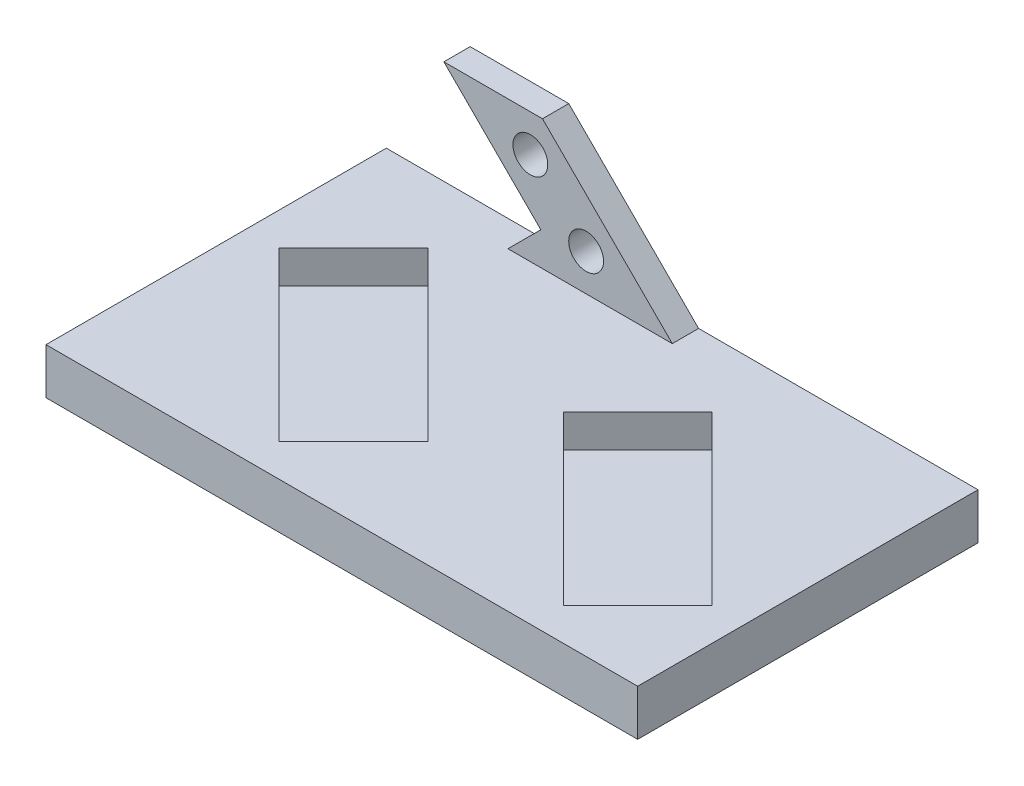
ISO-10303-21;
HEADER;
FILE_DESCRIPTION(('STEP AP214'),'2;1');
FILE_NAME('part.step','',(''),(''),'','','');
FILE_SCHEMA(('AUTOMOTIVE_DESIGN { 1 0 10303 214 1 1 1 1 }'));
ENDSEC;
DATA;
#1=APPLICATION_CONTEXT('core data for automotive mechanical design processes');
#2=APPLICATION_PROTOCOL_DEFINITION('international standard','automotive_design',2000,#1);
#3=PRODUCT_CONTEXT('',#1,'mechanical');
#4=PRODUCT('Part','Part','',(#3));
#5=PRODUCT_RELATED_PRODUCT_CATEGORY('part','',(#4));
#6=PRODUCT_DEFINITION_FORMATION('','',#4);
#7=PRODUCT_DEFINITION_CONTEXT('part definition',#1,'design');
#8=PRODUCT_DEFINITION('design','',#6,#7);
#9=PRODUCT_DEFINITION_SHAPE('','',#8);
#10=(LENGTH_UNIT() NAMED_UNIT(*) SI_UNIT(.MILLI.,.METRE.));
#11=(NAMED_UNIT(*) PLANE_ANGLE_UNIT() SI_UNIT($,.RADIAN.));
#12=(NAMED_UNIT(*) SI_UNIT($,.STERADIAN.) SOLID_ANGLE_UNIT());
#13=UNCERTAINTY_MEASURE_WITH_UNIT(LENGTH_MEASURE(1.E-05),#10,'distance_accuracy_value','');
#14=(GEOMETRIC_REPRESENTATION_CONTEXT(3) GLOBAL_UNCERTAINTY_ASSIGNED_CONTEXT((#13)) GLOBAL_UNIT_ASSIGNED_CONTEXT((#10,
#11,#12)) REPRESENTATION_CONTEXT('',''));
#15=CARTESIAN_POINT('',(0.,0.,0.));
#16=DIRECTION('',(0.,0.,1.));
#17=DIRECTION('',(1.,0.,0.));
#18=AXIS2_PLACEMENT_3D('',#15,#16,#17);
#19=CARTESIAN_POINT('',(90.0000000000001,5.,0.));
#20=DIRECTION('',(1.,0.,0.));
#21=DIRECTION('',(0.,0.,-1.));
#22=AXIS2_PLACEMENT_3D('',#19,#20,#21);
#23=PLANE('',#22);
#24=DIRECTION('',(0.,-1.,0.));
#25=VECTOR('',#24,1.);
#26=CARTESIAN_POINT('',(90.0000000000001,5.,51.7695526217004));
#27=LINE('',#26,#25);
#28=CARTESIAN_POINT('',(90.0000000000001,5.,51.7695526217004));
#29=VERTEX_POINT('',#28);
#30=CARTESIAN_POINT('',(90.,-2.,51.7695526217005));
#31=VERTEX_POINT('',#30);
#32=EDGE_CURVE('E284',#29,#31,#27,.T.);
#33=ORIENTED_EDGE('',*,*,#32,.T.);
#34=DIRECTION('',(0.,0.,1.));
#35=VECTOR('',#34,1.);
#36=CARTESIAN_POINT('',(90.,-2.,51.7695526217005));
#37=LINE('',#36,#35);
#38=CARTESIAN_POINT('',(90.,-2.,0.));
#39=VERTEX_POINT('',#38);
#40=EDGE_CURVE('E180',#39,#31,#37,.T.);
#41=ORIENTED_EDGE('',*,*,#40,.F.);
#42=DIRECTION('',(0.,-1.,0.));
#43=VECTOR('',#42,1.);
#44=CARTESIAN_POINT('',(90.0000000000001,5.,0.));
#45=LINE('',#44,#43);
#46=CARTESIAN_POINT('',(90.0000000000001,5.,0.));
#47=VERTEX_POINT('',#46);
#48=EDGE_CURVE('E169',#47,#39,#45,.T.);
#49=ORIENTED_EDGE('',*,*,#48,.F.);
#50=DIRECTION('',(0.,0.,1.));
#51=VECTOR('',#50,1.);
#52=CARTESIAN_POINT('',(90.0000000000001,5.,0.));
#53=LINE('',#52,#51);
#54=EDGE_CURVE('E252',#47,#29,#53,.T.);
#55=ORIENTED_EDGE('',*,*,#54,.T.);
#56=EDGE_LOOP('',(#33,#41,#49,#55));
#57=FACE_BOUND('',#56,.T.);
#58=ADVANCED_FACE('F41',(#57),#23,.T.);
#59=CARTESIAN_POINT('',(0.,5.,0.));
#60=DIRECTION('',(0.,0.,-1.));
#61=DIRECTION('',(-1.,0.,0.));
#62=AXIS2_PLACEMENT_3D('',#59,#60,#61);
#63=PLANE('',#62);
#64=DIRECTION('',(1.,0.,0.));
#65=VECTOR('',#64,1.);
#66=CARTESIAN_POINT('',(0.,5.,0.));
#67=LINE('',#66,#65);
#68=CARTESIAN_POINT('',(0.,5.,0.));
#69=VERTEX_POINT('',#68);
#70=CARTESIAN_POINT('',(22.5,5.,0.));
#71=VERTEX_POINT('',#70);
#72=EDGE_CURVE('E256',#69,#71,#67,.T.);
#73=ORIENTED_EDGE('',*,*,#72,.T.);
#74=DIRECTION('',(-0.707106781186555,-0.70710678118654,0.));
#75=VECTOR('',#74,1.);
#76=CARTESIAN_POINT('',(27.5,9.99999999999993,0.));
#77=LINE('',#76,#75);
#78=CARTESIAN_POINT('',(27.5,9.99999999999993,0.));
#79=VERTEX_POINT('',#78);
#80=EDGE_CURVE('E11',#71,#79,#77,.F.);
#81=ORIENTED_EDGE('',*,*,#80,.T.);
#82=DIRECTION('',(-0.707106781186546,0.707106781186549,0.));
#83=VECTOR('',#82,1.);
#84=CARTESIAN_POINT('',(12.7512626584709,24.7487373415291,0.));
#85=LINE('',#84,#83);
#86=CARTESIAN_POINT('',(12.7512626584709,24.7487373415291,0.));
#87=VERTEX_POINT('',#86);
#88=EDGE_CURVE('E200',#79,#87,#85,.T.);
#89=ORIENTED_EDGE('',*,*,#88,.T.);
#90=DIRECTION('',(1.,0.,0.));
#91=VECTOR('',#90,1.);
#92=CARTESIAN_POINT('',(27.7512626584709,24.7487373415291,0.));
#93=LINE('',#92,#91);
#94=CARTESIAN_POINT('',(27.7512626584709,24.7487373415291,0.));
#95=VERTEX_POINT('',#94);
#96=EDGE_CURVE('E214',#87,#95,#93,.T.);
#97=ORIENTED_EDGE('',*,*,#96,.T.);
#98=DIRECTION('',(0.707106781186546,-0.707106781186549,0.));
#99=VECTOR('',#98,1.);
#100=CARTESIAN_POINT('',(52.5,-1.48696832566314E-13,0.));
#101=LINE('',#100,#99);
#102=CARTESIAN_POINT('',(47.4999999999999,5.,0.));
#103=VERTEX_POINT('',#102);
#104=EDGE_CURVE('E206',#95,#103,#101,.T.);
#105=ORIENTED_EDGE('',*,*,#104,.T.);
#106=EDGE_CURVE('E255',#103,#47,#67,.T.);
#107=ORIENTED_EDGE('',*,*,#106,.T.);
#108=ORIENTED_EDGE('',*,*,#48,.T.);
#109=DIRECTION('',(1.,0.,0.));
#110=VECTOR('',#109,1.);
#111=CARTESIAN_POINT('',(0.,-2.,0.));
#112=LINE('',#111,#110);
#113=CARTESIAN_POINT('',(0.,-2.,0.));
#114=VERTEX_POINT('',#113);
#115=EDGE_CURVE('E173',#114,#39,#112,.T.);
#116=ORIENTED_EDGE('',*,*,#115,.F.);
#117=DIRECTION('',(0.,-1.,0.));
#118=VECTOR('',#117,1.);
#119=CARTESIAN_POINT('',(0.,5.,0.));
#120=LINE('',#119,#118);
#121=EDGE_CURVE('E160',#69,#114,#120,.T.);
#122=ORIENTED_EDGE('',*,*,#121,.F.);
#123=EDGE_LOOP('',(#73,#81,#89,#97,#105,#107,#108,#116,#122));
#124=FACE_BOUND('',#123,.T.);
#125=CARTESIAN_POINT('',(34.3933982822019,10.6066017177981,0.));
#126=DIRECTION('',(0.,0.,-1.));
#127=DIRECTION('',(-1.,0.,0.));
#128=AXIS2_PLACEMENT_3D('',#125,#126,#127);
#129=CIRCLE('',#128,2.65);
#130=CARTESIAN_POINT('',(31.7433982822019,10.6066017177981,0.));
#131=VERTEX_POINT('',#130);
#132=EDGE_CURVE('E190',#131,#131,#129,.T.);
#133=ORIENTED_EDGE('',*,*,#132,.F.);
#134=EDGE_LOOP('',(#133));
#135=FACE_BOUND('',#134,.T.);
#136=CARTESIAN_POINT('',(25.9081169079633,19.0918830920367,0.));
#137=DIRECTION('',(0.,0.,-1.));
#138=DIRECTION('',(-1.,0.,0.));
#139=AXIS2_PLACEMENT_3D('',#136,#137,#138);
#140=CIRCLE('',#139,2.65);
#141=CARTESIAN_POINT('',(23.2581169079633,19.0918830920367,0.));
#142=VERTEX_POINT('',#141);
#143=EDGE_CURVE('E194',#142,#142,#140,.T.);
#144=ORIENTED_EDGE('',*,*,#143,.F.);
#145=EDGE_LOOP('',(#144));
#146=FACE_BOUND('',#145,.T.);
#147=ADVANCED_FACE('F174',(#124,#135,#146),#63,.T.);
#148=CARTESIAN_POINT('',(0.,5.,0.));
#149=DIRECTION('',(1.,0.,0.));
#150=DIRECTION('',(0.,0.,-1.));
#151=AXIS2_PLACEMENT_3D('',#148,#149,#150);
#152=PLANE('',#151);
#153=ORIENTED_EDGE('',*,*,#121,.T.);
#154=DIRECTION('',(0.,0.,-1.));
#155=VECTOR('',#154,1.);
#156=CARTESIAN_POINT('',(0.,-2.,51.7695526217005));
#157=LINE('',#156,#155);
#158=CARTESIAN_POINT('',(0.,-2.,51.7695526217005));
#159=VERTEX_POINT('',#158);
#160=EDGE_CURVE('E165',#159,#114,#157,.T.);
#161=ORIENTED_EDGE('',*,*,#160,.F.);
#162=DIRECTION('',(0.,-1.,0.));
#163=VECTOR('',#162,1.);
#164=CARTESIAN_POINT('',(0.,5.,51.7695526217004));
#165=LINE('',#164,#163);
#166=CARTESIAN_POINT('',(0.,5.,51.7695526217004));
#167=VERTEX_POINT('',#166);
#168=EDGE_CURVE('E170',#167,#159,#165,.T.);
#169=ORIENTED_EDGE('',*,*,#168,.F.);
#170=DIRECTION('',(0.,0.,1.));
#171=VECTOR('',#170,1.);
#172=CARTESIAN_POINT('',(0.,5.,0.));
#173=LINE('',#172,#171);
#174=EDGE_CURVE('E167',#69,#167,#173,.T.);
#175=ORIENTED_EDGE('',*,*,#174,.F.);
#176=EDGE_LOOP('',(#153,#161,#169,#175));
#177=FACE_BOUND('',#176,.T.);
#178=ADVANCED_FACE('F162',(#177),#152,.F.);
#179=CARTESIAN_POINT('',(13.1568542494924,5.,13.1568542494924));
#180=DIRECTION('',(0.707106781186548,0.,0.707106781186547));
#181=DIRECTION('',(0.707106781186547,0.,-0.707106781186548));
#182=AXIS2_PLACEMENT_3D('',#179,#180,#181);
#183=PLANE('',#182);
#184=DIRECTION('',(-0.707106781186547,0.,0.707106781186548));
#185=VECTOR('',#184,1.);
#186=CARTESIAN_POINT('',(13.1568542494924,0.,13.1568542494924));
#187=LINE('',#186,#185);
#188=CARTESIAN_POINT('',(16.3137084989848,0.,10.));
#189=VERTEX_POINT('',#188);
#190=CARTESIAN_POINT('',(5.,0.,21.3137084989848));
#191=VERTEX_POINT('',#190);
#192=EDGE_CURVE('E273',#189,#191,#187,.T.);
#193=ORIENTED_EDGE('',*,*,#192,.F.);
#194=DIRECTION('',(0.,-1.,0.));
#195=VECTOR('',#194,1.);
#196=CARTESIAN_POINT('',(16.3137084989848,5.,10.));
#197=LINE('',#196,#195);
#198=CARTESIAN_POINT('',(16.3137084989848,5.,10.));
#199=VERTEX_POINT('',#198);
#200=EDGE_CURVE('E286',#199,#189,#197,.T.);
#201=ORIENTED_EDGE('',*,*,#200,.F.);
#202=DIRECTION('',(-0.707106781186547,0.,0.707106781186548));
#203=VECTOR('',#202,1.);
#204=CARTESIAN_POINT('',(13.1568542494924,5.,13.1568542494924));
#205=LINE('',#204,#203);
#206=CARTESIAN_POINT('',(5.,5.,21.3137084989848));
#207=VERTEX_POINT('',#206);
#208=EDGE_CURVE('E240',#199,#207,#205,.T.);
#209=ORIENTED_EDGE('',*,*,#208,.T.);
#210=DIRECTION('',(0.,-1.,0.));
#211=VECTOR('',#210,1.);
#212=CARTESIAN_POINT('',(5.,5.,21.3137084989848));
#213=LINE('',#212,#211);
#214=EDGE_CURVE('E290',#207,#191,#213,.T.);
#215=ORIENTED_EDGE('',*,*,#214,.T.);
#216=EDGE_LOOP('',(#193,#201,#209,#215));
#217=FACE_BOUND('',#216,.T.);
#218=ADVANCED_FACE('F365',(#217),#183,.T.);
#219=CARTESIAN_POINT('',(3.15685424949237,5.,-3.15685424949237));
#220=DIRECTION('',(-0.707106781186547,0.,0.707106781186548));
#221=DIRECTION('',(0.707106781186548,0.,0.707106781186547));
#222=AXIS2_PLACEMENT_3D('',#219,#220,#221);
#223=PLANE('',#222);
#224=DIRECTION('',(-0.707106781186548,0.,-0.707106781186547));
#225=VECTOR('',#224,1.);
#226=CARTESIAN_POINT('',(3.15685424949237,0.,-3.15685424949237));
#227=LINE('',#226,#225);
#228=CARTESIAN_POINT('',(41.7695526217005,0.,35.4558441227157));
#229=VERTEX_POINT('',#228);
#230=EDGE_CURVE('E276',#229,#189,#227,.T.);
#231=ORIENTED_EDGE('',*,*,#230,.F.);
#232=DIRECTION('',(0.,-1.,0.));
#233=VECTOR('',#232,1.);
#234=CARTESIAN_POINT('',(41.7695526217005,5.,35.4558441227157));
#235=LINE('',#234,#233);
#236=CARTESIAN_POINT('',(41.7695526217005,5.,35.4558441227157));
#237=VERTEX_POINT('',#236);
#238=EDGE_CURVE('E295',#237,#229,#235,.T.);
#239=ORIENTED_EDGE('',*,*,#238,.F.);
#240=DIRECTION('',(-0.707106781186548,0.,-0.707106781186547));
#241=VECTOR('',#240,1.);
#242=CARTESIAN_POINT('',(3.15685424949237,5.,-3.15685424949237));
#243=LINE('',#242,#241);
#244=EDGE_CURVE('E243',#237,#199,#243,.T.);
#245=ORIENTED_EDGE('',*,*,#244,.T.);
#246=ORIENTED_EDGE('',*,*,#200,.T.);
#247=EDGE_LOOP('',(#231,#239,#245,#246));
#248=FACE_BOUND('',#247,.T.);
#249=ADVANCED_FACE('F361',(#248),#223,.T.);
#250=CARTESIAN_POINT('',(38.6126983722081,5.,38.6126983722081));
#251=DIRECTION('',(-0.707106781186548,0.,-0.707106781186547));
#252=DIRECTION('',(-0.707106781186547,0.,0.707106781186548));
#253=AXIS2_PLACEMENT_3D('',#250,#251,#252);
#254=PLANE('',#253);
#255=DIRECTION('',(0.707106781186547,0.,-0.707106781186548));
#256=VECTOR('',#255,1.);
#257=CARTESIAN_POINT('',(38.6126983722081,0.,38.6126983722081));
#258=LINE('',#257,#256);
#259=CARTESIAN_POINT('',(30.4558441227157,0.,46.7695526217004));
#260=VERTEX_POINT('',#259);
#261=EDGE_CURVE('E279',#260,#229,#258,.T.);
#262=ORIENTED_EDGE('',*,*,#261,.F.);
#263=DIRECTION('',(0.,-1.,0.));
#264=VECTOR('',#263,1.);
#265=CARTESIAN_POINT('',(30.4558441227157,5.,46.7695526217004));
#266=LINE('',#265,#264);
#267=CARTESIAN_POINT('',(30.4558441227157,5.,46.7695526217004));
#268=VERTEX_POINT('',#267);
#269=EDGE_CURVE('E292',#268,#260,#266,.T.);
#270=ORIENTED_EDGE('',*,*,#269,.F.);
#271=DIRECTION('',(0.707106781186547,0.,-0.707106781186548));
#272=VECTOR('',#271,1.);
#273=CARTESIAN_POINT('',(38.6126983722081,5.,38.6126983722081));
#274=LINE('',#273,#272);
#275=EDGE_CURVE('E246',#268,#237,#274,.T.);
#276=ORIENTED_EDGE('',*,*,#275,.T.);
#277=ORIENTED_EDGE('',*,*,#238,.T.);
#278=EDGE_LOOP('',(#262,#270,#276,#277));
#279=FACE_BOUND('',#278,.T.);
#280=ADVANCED_FACE('F357',(#279),#254,.T.);
#281=CARTESIAN_POINT('',(34.7720779386422,5.,34.7720779386423));
#282=DIRECTION('',(0.707106781186546,0.,0.707106781186549));
#283=DIRECTION('',(0.707106781186549,0.,-0.707106781186546));
#284=AXIS2_PLACEMENT_3D('',#281,#282,#283);
#285=PLANE('',#284);
#286=DIRECTION('',(-0.707106781186549,0.,0.707106781186546));
#287=VECTOR('',#286,1.);
#288=CARTESIAN_POINT('',(34.7720779386422,0.,34.7720779386423));
#289=LINE('',#288,#287);
#290=CARTESIAN_POINT('',(59.5441558772844,0.,10.0000000000002));
#291=VERTEX_POINT('',#290);
#292=CARTESIAN_POINT('',(48.2304473782997,0.,21.3137084989849));
#293=VERTEX_POINT('',#292);
#294=EDGE_CURVE('E226',#291,#293,#289,.T.);
#295=ORIENTED_EDGE('',*,*,#294,.F.);
#296=DIRECTION('',(0.,-1.,0.));
#297=VECTOR('',#296,1.);
#298=CARTESIAN_POINT('',(59.5441558772844,5.,10.0000000000002));
#299=LINE('',#298,#297);
#300=CARTESIAN_POINT('',(59.5441558772844,5.,10.0000000000002));
#301=VERTEX_POINT('',#300);
#302=EDGE_CURVE('E293',#301,#291,#299,.T.);
#303=ORIENTED_EDGE('',*,*,#302,.F.);
#304=DIRECTION('',(-0.707106781186549,0.,0.707106781186546));
#305=VECTOR('',#304,1.);
#306=CARTESIAN_POINT('',(34.7720779386422,5.,34.7720779386423));
#307=LINE('',#306,#305);
#308=CARTESIAN_POINT('',(48.2304473782997,5.,21.3137084989849));
#309=VERTEX_POINT('',#308);
#310=EDGE_CURVE('E227',#301,#309,#307,.T.);
#311=ORIENTED_EDGE('',*,*,#310,.T.);
#312=DIRECTION('',(0.,-1.,0.));
#313=VECTOR('',#312,1.);
#314=CARTESIAN_POINT('',(48.2304473782997,5.,21.3137084989849));
#315=LINE('',#314,#313);
#316=EDGE_CURVE('E261',#309,#293,#315,.T.);
#317=ORIENTED_EDGE('',*,*,#316,.T.);
#318=EDGE_LOOP('',(#295,#303,#311,#317));
#319=FACE_BOUND('',#318,.T.);
#320=ADVANCED_FACE('F360',(#319),#285,.T.);
#321=CARTESIAN_POINT('',(24.7720779386423,5.,-24.7720779386422));
#322=DIRECTION('',(-0.70710678118655,0.,0.707106781186545));
#323=DIRECTION('',(0.707106781186545,0.,0.70710678118655));
#324=AXIS2_PLACEMENT_3D('',#321,#322,#323);
#325=PLANE('',#324);
#326=DIRECTION('',(-0.707106781186545,0.,-0.70710678118655));
#327=VECTOR('',#326,1.);
#328=CARTESIAN_POINT('',(24.7720779386423,0.,-24.7720779386422));
#329=LINE('',#328,#327);
#330=CARTESIAN_POINT('',(85.0000000000001,0.,35.455844122716));
#331=VERTEX_POINT('',#330);
#332=EDGE_CURVE('E264',#331,#291,#329,.T.);
#333=ORIENTED_EDGE('',*,*,#332,.F.);
#334=DIRECTION('',(0.,-1.,0.));
#335=VECTOR('',#334,1.);
#336=CARTESIAN_POINT('',(85.0000000000001,5.,35.455844122716));
#337=LINE('',#336,#335);
#338=CARTESIAN_POINT('',(85.0000000000001,5.,35.455844122716));
#339=VERTEX_POINT('',#338);
#340=EDGE_CURVE('E302',#339,#331,#337,.T.);
#341=ORIENTED_EDGE('',*,*,#340,.F.);
#342=DIRECTION('',(-0.707106781186545,0.,-0.70710678118655));
#343=VECTOR('',#342,1.);
#344=CARTESIAN_POINT('',(24.7720779386423,5.,-24.7720779386422));
#345=LINE('',#344,#343);
#346=EDGE_CURVE('E230',#339,#301,#345,.T.);
#347=ORIENTED_EDGE('',*,*,#346,.T.);
#348=ORIENTED_EDGE('',*,*,#302,.T.);
#349=EDGE_LOOP('',(#333,#341,#347,#348));
#350=FACE_BOUND('',#349,.T.);
#351=ADVANCED_FACE('F372',(#350),#325,.T.);
#352=CARTESIAN_POINT('',(60.2279220613577,5.,60.2279220613581));
#353=DIRECTION('',(-0.707106781186545,0.,-0.70710678118655));
#354=DIRECTION('',(-0.70710678118655,0.,0.707106781186545));
#355=AXIS2_PLACEMENT_3D('',#352,#353,#354);
#356=PLANE('',#355);
#357=DIRECTION('',(0.70710678118655,0.,-0.707106781186545));
#358=VECTOR('',#357,1.);
#359=CARTESIAN_POINT('',(60.2279220613577,0.,60.2279220613581));
#360=LINE('',#359,#358);
#361=CARTESIAN_POINT('',(73.6862915010153,0.,46.7695526217007));
#362=VERTEX_POINT('',#361);
#363=EDGE_CURVE('E267',#362,#331,#360,.T.);
#364=ORIENTED_EDGE('',*,*,#363,.F.);
#365=DIRECTION('',(0.,-1.,0.));
#366=VECTOR('',#365,1.);
#367=CARTESIAN_POINT('',(73.6862915010153,5.,46.7695526217007));
#368=LINE('',#367,#366);
#369=CARTESIAN_POINT('',(73.6862915010153,5.,46.7695526217007));
#370=VERTEX_POINT('',#369);
#371=EDGE_CURVE('E300',#370,#362,#368,.T.);
#372=ORIENTED_EDGE('',*,*,#371,.F.);
#373=DIRECTION('',(0.70710678118655,0.,-0.707106781186545));
#374=VECTOR('',#373,1.);
#375=CARTESIAN_POINT('',(60.2279220613577,5.,60.2279220613581));
#376=LINE('',#375,#374);
#377=EDGE_CURVE('E234',#370,#339,#376,.T.);
#378=ORIENTED_EDGE('',*,*,#377,.T.);
#379=ORIENTED_EDGE('',*,*,#340,.T.);
#380=EDGE_LOOP('',(#364,#372,#378,#379));
#381=FACE_BOUND('',#380,.T.);
#382=ADVANCED_FACE('F355',(#381),#356,.T.);
#383=CARTESIAN_POINT('',(-8.15685424949239,5.,8.1568542494924));
#384=DIRECTION('',(0.707106781186547,0.,-0.707106781186548));
#385=DIRECTION('',(-0.707106781186548,0.,-0.707106781186547));
#386=AXIS2_PLACEMENT_3D('',#383,#384,#385);
#387=PLANE('',#386);
#388=DIRECTION('',(0.707106781186548,0.,0.707106781186547));
#389=VECTOR('',#388,1.);
#390=CARTESIAN_POINT('',(-8.15685424949239,0.,8.1568542494924));
#391=LINE('',#390,#389);
#392=EDGE_CURVE('E231',#191,#260,#391,.T.);
#393=ORIENTED_EDGE('',*,*,#392,.F.);
#394=ORIENTED_EDGE('',*,*,#214,.F.);
#395=DIRECTION('',(0.707106781186548,0.,0.707106781186547));
#396=VECTOR('',#395,1.);
#397=CARTESIAN_POINT('',(-8.15685424949239,5.,8.1568542494924));
#398=LINE('',#397,#396);
#399=EDGE_CURVE('E249',#207,#268,#398,.T.);
#400=ORIENTED_EDGE('',*,*,#399,.T.);
#401=ORIENTED_EDGE('',*,*,#269,.T.);
#402=EDGE_LOOP('',(#393,#394,#400,#401));
#403=FACE_BOUND('',#402,.T.);
#404=ADVANCED_FACE('F342',(#403),#387,.T.);
#405=CARTESIAN_POINT('',(13.4583694396575,5.,-13.4583694396574));
#406=DIRECTION('',(0.70710678118655,0.,-0.707106781186545));
#407=DIRECTION('',(-0.707106781186545,0.,-0.70710678118655));
#408=AXIS2_PLACEMENT_3D('',#405,#406,#407);
#409=PLANE('',#408);
#410=DIRECTION('',(0.707106781186545,0.,0.70710678118655));
#411=VECTOR('',#410,1.);
#412=CARTESIAN_POINT('',(13.4583694396575,0.,-13.4583694396574));
#413=LINE('',#412,#411);
#414=EDGE_CURVE('E270',#293,#362,#413,.T.);
#415=ORIENTED_EDGE('',*,*,#414,.F.);
#416=ORIENTED_EDGE('',*,*,#316,.F.);
#417=DIRECTION('',(0.707106781186545,0.,0.70710678118655));
#418=VECTOR('',#417,1.);
#419=CARTESIAN_POINT('',(13.4583694396575,5.,-13.4583694396574));
#420=LINE('',#419,#418);
#421=EDGE_CURVE('E237',#309,#370,#420,.T.);
#422=ORIENTED_EDGE('',*,*,#421,.T.);
#423=ORIENTED_EDGE('',*,*,#371,.T.);
#424=EDGE_LOOP('',(#415,#416,#422,#423));
#425=FACE_BOUND('',#424,.T.);
#426=ADVANCED_FACE('F335',(#425),#409,.T.);
#427=CARTESIAN_POINT('',(0.,5.,51.7695526217004));
#428=DIRECTION('',(0.,0.,-1.));
#429=DIRECTION('',(-1.,0.,0.));
#430=AXIS2_PLACEMENT_3D('',#427,#428,#429);
#431=PLANE('',#430);
#432=ORIENTED_EDGE('',*,*,#168,.T.);
#433=DIRECTION('',(-1.,0.,0.));
#434=VECTOR('',#433,1.);
#435=CARTESIAN_POINT('',(0.,-2.,51.7695526217005));
#436=LINE('',#435,#434);
#437=EDGE_CURVE('E185',#31,#159,#436,.T.);
#438=ORIENTED_EDGE('',*,*,#437,.F.);
#439=ORIENTED_EDGE('',*,*,#32,.F.);
#440=DIRECTION('',(1.,0.,0.));
#441=VECTOR('',#440,1.);
#442=CARTESIAN_POINT('',(0.,5.,51.7695526217004));
#443=LINE('',#442,#441);
#444=EDGE_CURVE('E259',#167,#29,#443,.T.);
#445=ORIENTED_EDGE('',*,*,#444,.F.);
#446=EDGE_LOOP('',(#432,#438,#439,#445));
#447=FACE_BOUND('',#446,.T.);
#448=ADVANCED_FACE('F333',(#447),#431,.F.);
#449=CARTESIAN_POINT('',(0.,5.,0.));
#450=DIRECTION('',(0.,1.,0.));
#451=DIRECTION('',(0.,0.,1.));
#452=AXIS2_PLACEMENT_3D('',#449,#450,#451);
#453=PLANE('',#452);
#454=DIRECTION('',(1.,0.,0.));
#455=VECTOR('',#454,1.);
#456=CARTESIAN_POINT('',(0.,5.,4.));
#457=LINE('',#456,#455);
#458=CARTESIAN_POINT('',(22.5,5.,4.));
#459=VERTEX_POINT('',#458);
#460=CARTESIAN_POINT('',(47.4999999999999,5.,4.00000000000001));
#461=VERTEX_POINT('',#460);
#462=EDGE_CURVE('E57',#459,#461,#457,.T.);
#463=ORIENTED_EDGE('',*,*,#462,.F.);
#464=DIRECTION('',(0.,0.,-1.));
#465=VECTOR('',#464,1.);
#466=CARTESIAN_POINT('',(22.5,5.,0.));
#467=LINE('',#466,#465);
#468=EDGE_CURVE('E62',#459,#71,#467,.T.);
#469=ORIENTED_EDGE('',*,*,#468,.T.);
#470=ORIENTED_EDGE('',*,*,#72,.F.);
#471=ORIENTED_EDGE('',*,*,#174,.T.);
#472=ORIENTED_EDGE('',*,*,#444,.T.);
#473=ORIENTED_EDGE('',*,*,#54,.F.);
#474=ORIENTED_EDGE('',*,*,#106,.F.);
#475=DIRECTION('',(0.,0.,-1.));
#476=VECTOR('',#475,1.);
#477=CARTESIAN_POINT('',(47.4999999999999,5.,0.));
#478=LINE('',#477,#476);
#479=EDGE_CURVE('E223',#461,#103,#478,.T.);
#480=ORIENTED_EDGE('',*,*,#479,.F.);
#481=EDGE_LOOP('',(#463,#469,#470,#471,#472,#473,#474,#480));
#482=FACE_BOUND('',#481,.T.);
#483=ORIENTED_EDGE('',*,*,#310,.F.);
#484=ORIENTED_EDGE('',*,*,#346,.F.);
#485=ORIENTED_EDGE('',*,*,#377,.F.);
#486=ORIENTED_EDGE('',*,*,#421,.F.);
#487=EDGE_LOOP('',(#483,#484,#485,#486));
#488=FACE_BOUND('',#487,.T.);
#489=ORIENTED_EDGE('',*,*,#208,.F.);
#490=ORIENTED_EDGE('',*,*,#244,.F.);
#491=ORIENTED_EDGE('',*,*,#275,.F.);
#492=ORIENTED_EDGE('',*,*,#399,.F.);
#493=EDGE_LOOP('',(#489,#490,#491,#492));
#494=FACE_BOUND('',#493,.T.);
#495=ADVANCED_FACE('F328',(#482,#488,#494),#453,.T.);
#496=CARTESIAN_POINT('',(52.5,-1.48696832566314E-13,4.00000000000001));
#497=DIRECTION('',(0.707106781186549,0.707106781186546,0.));
#498=DIRECTION('',(-0.707106781186546,0.707106781186549,0.));
#499=AXIS2_PLACEMENT_3D('',#496,#497,#498);
#500=PLANE('',#499);
#501=DIRECTION('',(0.707106781186546,-0.707106781186549,0.));
#502=VECTOR('',#501,1.);
#503=CARTESIAN_POINT('',(52.5,-1.48696832566314E-13,4.00000000000001));
#504=LINE('',#503,#502);
#505=CARTESIAN_POINT('',(27.7512626584709,24.7487373415291,4.));
#506=VERTEX_POINT('',#505);
#507=EDGE_CURVE('E209',#506,#461,#504,.T.);
#508=ORIENTED_EDGE('',*,*,#507,.T.);
#509=ORIENTED_EDGE('',*,*,#479,.T.);
#510=ORIENTED_EDGE('',*,*,#104,.F.);
#511=DIRECTION('',(0.,0.,-1.));
#512=VECTOR('',#511,1.);
#513=CARTESIAN_POINT('',(27.7512626584709,24.7487373415291,4.));
#514=LINE('',#513,#512);
#515=EDGE_CURVE('E218',#506,#95,#514,.T.);
#516=ORIENTED_EDGE('',*,*,#515,.F.);
#517=EDGE_LOOP('',(#508,#509,#510,#516));
#518=FACE_BOUND('',#517,.T.);
#519=ADVANCED_FACE('F325',(#518),#500,.T.);
#520=CARTESIAN_POINT('',(27.7512626584709,24.7487373415291,4.));
#521=DIRECTION('',(0.,1.,0.));
#522=DIRECTION('',(-1.,0.,0.));
#523=AXIS2_PLACEMENT_3D('',#520,#521,#522);
#524=PLANE('',#523);
#525=ORIENTED_EDGE('',*,*,#96,.F.);
#526=DIRECTION('',(0.,0.,-1.));
#527=VECTOR('',#526,1.);
#528=CARTESIAN_POINT('',(12.7512626584709,24.7487373415291,4.));
#529=LINE('',#528,#527);
#530=CARTESIAN_POINT('',(12.7512626584709,24.7487373415291,4.));
#531=VERTEX_POINT('',#530);
#532=EDGE_CURVE('E212',#531,#87,#529,.T.);
#533=ORIENTED_EDGE('',*,*,#532,.F.);
#534=DIRECTION('',(1.,0.,0.));
#535=VECTOR('',#534,1.);
#536=CARTESIAN_POINT('',(27.7512626584709,24.7487373415291,4.));
#537=LINE('',#536,#535);
#538=EDGE_CURVE('E205',#531,#506,#537,.T.);
#539=ORIENTED_EDGE('',*,*,#538,.T.);
#540=ORIENTED_EDGE('',*,*,#515,.T.);
#541=EDGE_LOOP('',(#525,#533,#539,#540));
#542=FACE_BOUND('',#541,.T.);
#543=ADVANCED_FACE('F322',(#542),#524,.T.);
#544=CARTESIAN_POINT('',(12.7512626584709,24.7487373415291,4.));
#545=DIRECTION('',(-0.707106781186549,-0.707106781186546,0.));
#546=DIRECTION('',(0.707106781186546,-0.707106781186549,0.));
#547=AXIS2_PLACEMENT_3D('',#544,#545,#546);
#548=PLANE('',#547);
#549=ORIENTED_EDGE('',*,*,#88,.F.);
#550=DIRECTION('',(0.,0.,1.));
#551=VECTOR('',#550,1.);
#552=CARTESIAN_POINT('',(27.5,9.99999999999993,4.));
#553=LINE('',#552,#551);
#554=CARTESIAN_POINT('',(27.5,9.99999999999993,4.));
#555=VERTEX_POINT('',#554);
#556=EDGE_CURVE('E289',#79,#555,#553,.T.);
#557=ORIENTED_EDGE('',*,*,#556,.T.);
#558=DIRECTION('',(-0.707106781186546,0.707106781186549,0.));
#559=VECTOR('',#558,1.);
#560=CARTESIAN_POINT('',(12.7512626584709,24.7487373415291,4.));
#561=LINE('',#560,#559);
#562=EDGE_CURVE('E203',#555,#531,#561,.T.);
#563=ORIENTED_EDGE('',*,*,#562,.T.);
#564=ORIENTED_EDGE('',*,*,#532,.T.);
#565=EDGE_LOOP('',(#549,#557,#563,#564));
#566=FACE_BOUND('',#565,.T.);
#567=ADVANCED_FACE('F318',(#566),#548,.T.);
#568=CARTESIAN_POINT('',(0.,0.,4.));
#569=DIRECTION('',(0.,0.,1.));
#570=DIRECTION('',(1.,0.,0.));
#571=AXIS2_PLACEMENT_3D('',#568,#569,#570);
#572=PLANE('',#571);
#573=CARTESIAN_POINT('',(34.3933982822019,10.6066017177981,4.00000000000001));
#574=DIRECTION('',(0.,0.,-1.));
#575=DIRECTION('',(-1.,0.,0.));
#576=AXIS2_PLACEMENT_3D('',#573,#574,#575);
#577=CIRCLE('',#576,2.65);
#578=CARTESIAN_POINT('',(31.7433982822019,10.6066017177981,4.00000000000001));
#579=VERTEX_POINT('',#578);
#580=EDGE_CURVE('E191',#579,#579,#577,.T.);
#581=ORIENTED_EDGE('',*,*,#580,.T.);
#582=EDGE_LOOP('',(#581));
#583=FACE_BOUND('',#582,.T.);
#584=CARTESIAN_POINT('',(25.9081169079633,19.0918830920367,4.));
#585=DIRECTION('',(0.,0.,-1.));
#586=DIRECTION('',(-1.,0.,0.));
#587=AXIS2_PLACEMENT_3D('',#584,#585,#586);
#588=CIRCLE('',#587,2.65);
#589=CARTESIAN_POINT('',(23.2581169079633,19.0918830920367,4.));
#590=VERTEX_POINT('',#589);
#591=EDGE_CURVE('E197',#590,#590,#588,.T.);
#592=ORIENTED_EDGE('',*,*,#591,.T.);
#593=EDGE_LOOP('',(#592));
#594=FACE_BOUND('',#593,.T.);
#595=ORIENTED_EDGE('',*,*,#562,.F.);
#596=DIRECTION('',(0.707106781186555,0.70710678118654,0.));
#597=VECTOR('',#596,1.);
#598=CARTESIAN_POINT('',(27.5,9.99999999999993,4.));
#599=LINE('',#598,#597);
#600=EDGE_CURVE('E50',#555,#459,#599,.F.);
#601=ORIENTED_EDGE('',*,*,#600,.T.);
#602=ORIENTED_EDGE('',*,*,#462,.T.);
#603=ORIENTED_EDGE('',*,*,#507,.F.);
#604=ORIENTED_EDGE('',*,*,#538,.F.);
#605=EDGE_LOOP('',(#595,#601,#602,#603,#604));
#606=FACE_BOUND('',#605,.T.);
#607=ADVANCED_FACE('F310',(#583,#594,#606),#572,.T.);
#608=CARTESIAN_POINT('',(25.9081169079633,19.0918830920367,4.));
#609=DIRECTION('',(0.,0.,-1.));
#610=DIRECTION('',(-1.,0.,0.));
#611=AXIS2_PLACEMENT_3D('',#608,#609,#610);
#612=CYLINDRICAL_SURFACE('',#611,2.65);
#613=ORIENTED_EDGE('',*,*,#591,.F.);
#614=EDGE_LOOP('',(#613));
#615=FACE_BOUND('',#614,.T.);
#616=ORIENTED_EDGE('',*,*,#143,.T.);
#617=EDGE_LOOP('',(#616));
#618=FACE_BOUND('',#617,.T.);
#619=ADVANCED_FACE('F410',(#615,#618),#612,.F.);
#620=CARTESIAN_POINT('',(34.3933982822019,10.6066017177981,4.00000000000001));
#621=DIRECTION('',(0.,0.,-1.));
#622=DIRECTION('',(-1.,0.,0.));
#623=AXIS2_PLACEMENT_3D('',#620,#621,#622);
#624=CYLINDRICAL_SURFACE('',#623,2.65);
#625=ORIENTED_EDGE('',*,*,#580,.F.);
#626=EDGE_LOOP('',(#625));
#627=FACE_BOUND('',#626,.T.);
#628=ORIENTED_EDGE('',*,*,#132,.T.);
#629=EDGE_LOOP('',(#628));
#630=FACE_BOUND('',#629,.T.);
#631=ADVANCED_FACE('F405',(#627,#630),#624,.F.);
#632=CARTESIAN_POINT('',(27.5,9.99999999999993,4.));
#633=DIRECTION('',(-0.70710678118654,0.707106781186555,0.));
#634=DIRECTION('',(0.,0.,-1.));
#635=AXIS2_PLACEMENT_3D('',#632,#633,#634);
#636=PLANE('',#635);
#637=ORIENTED_EDGE('',*,*,#80,.F.);
#638=ORIENTED_EDGE('',*,*,#468,.F.);
#639=ORIENTED_EDGE('',*,*,#600,.F.);
#640=ORIENTED_EDGE('',*,*,#556,.F.);
#641=EDGE_LOOP('',(#637,#638,#639,#640));
#642=FACE_BOUND('',#641,.T.);
#643=ADVANCED_FACE('F44',(#642),#636,.T.);
#644=CARTESIAN_POINT('',(0.,0.,0.));
#645=DIRECTION('',(0.,-1.,0.));
#646=DIRECTION('',(0.,0.,-1.));
#647=AXIS2_PLACEMENT_3D('',#644,#645,#646);
#648=PLANE('',#647);
#649=ORIENTED_EDGE('',*,*,#230,.T.);
#650=ORIENTED_EDGE('',*,*,#192,.T.);
#651=ORIENTED_EDGE('',*,*,#392,.T.);
#652=ORIENTED_EDGE('',*,*,#261,.T.);
#653=EDGE_LOOP('',(#649,#650,#651,#652));
#654=FACE_BOUND('',#653,.T.);
#655=ADVANCED_FACE('F398',(#654),#648,.F.);
#656=ORIENTED_EDGE('',*,*,#332,.T.);
#657=ORIENTED_EDGE('',*,*,#294,.T.);
#658=ORIENTED_EDGE('',*,*,#414,.T.);
#659=ORIENTED_EDGE('',*,*,#363,.T.);
#660=EDGE_LOOP('',(#656,#657,#658,#659));
#661=FACE_BOUND('',#660,.T.);
#662=ADVANCED_FACE('F385',(#661),#648,.F.);
#663=CARTESIAN_POINT('',(0.,-2.,0.));
#664=DIRECTION('',(0.,-1.,0.));
#665=DIRECTION('',(0.,0.,-1.));
#666=AXIS2_PLACEMENT_3D('',#663,#664,#665);
#667=PLANE('',#666);
#668=ORIENTED_EDGE('',*,*,#160,.T.);
#669=ORIENTED_EDGE('',*,*,#115,.T.);
#670=ORIENTED_EDGE('',*,*,#40,.T.);
#671=ORIENTED_EDGE('',*,*,#437,.T.);
#672=EDGE_LOOP('',(#668,#669,#670,#671));
#673=FACE_BOUND('',#672,.T.);
#674=ADVANCED_FACE('F183',(#673),#667,.T.);
#675=CLOSED_SHELL('',(#58,#147,#178,#218,#249,#280,#320,#351,#382,#404,#426,#448,#495,#519,#543,
#567,#607,#619,#631,#643,#655,#662,#674));
#676=MANIFOLD_SOLID_BREP('B2',#675);
#677=ADVANCED_BREP_SHAPE_REPRESENTATION('',(#18,#676),#14);
#678=SHAPE_DEFINITION_REPRESENTATION(#9,#677);
ENDSEC;
END-ISO-10303-21;
